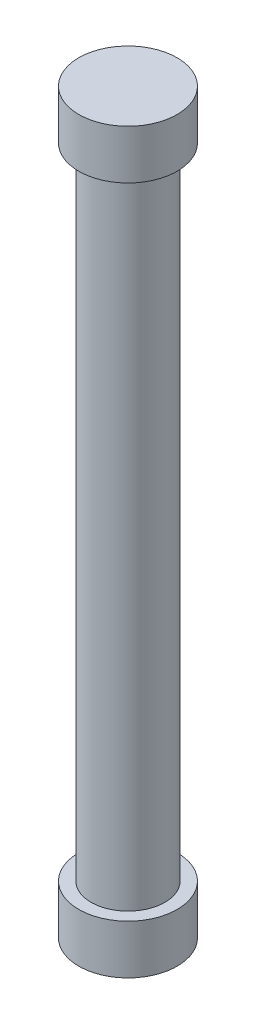
ISO-10303-21;
HEADER;
FILE_DESCRIPTION(('STEP AP214'),'2;1');
FILE_NAME('part.step','',(''),(''),'','','');
FILE_SCHEMA(('AUTOMOTIVE_DESIGN { 1 0 10303 214 1 1 1 1 }'));
ENDSEC;
DATA;
#1=APPLICATION_CONTEXT('core data for automotive mechanical design processes');
#2=APPLICATION_PROTOCOL_DEFINITION('international standard','automotive_design',2000,#1);
#3=PRODUCT_CONTEXT('',#1,'mechanical');
#4=PRODUCT('Part','Part','',(#3));
#5=PRODUCT_RELATED_PRODUCT_CATEGORY('part','',(#4));
#6=PRODUCT_DEFINITION_FORMATION('','',#4);
#7=PRODUCT_DEFINITION_CONTEXT('part definition',#1,'design');
#8=PRODUCT_DEFINITION('design','',#6,#7);
#9=PRODUCT_DEFINITION_SHAPE('','',#8);
#10=(LENGTH_UNIT() NAMED_UNIT(*) SI_UNIT(.MILLI.,.METRE.));
#11=(NAMED_UNIT(*) PLANE_ANGLE_UNIT() SI_UNIT($,.RADIAN.));
#12=(NAMED_UNIT(*) SI_UNIT($,.STERADIAN.) SOLID_ANGLE_UNIT());
#13=UNCERTAINTY_MEASURE_WITH_UNIT(LENGTH_MEASURE(1.E-05),#10,'distance_accuracy_value','');
#14=(GEOMETRIC_REPRESENTATION_CONTEXT(3) GLOBAL_UNCERTAINTY_ASSIGNED_CONTEXT((#13)) GLOBAL_UNIT_ASSIGNED_CONTEXT((#10,
#11,#12)) REPRESENTATION_CONTEXT('',''));
#15=CARTESIAN_POINT('',(0.,0.,0.));
#16=DIRECTION('',(0.,0.,1.));
#17=DIRECTION('',(1.,0.,0.));
#18=AXIS2_PLACEMENT_3D('',#15,#16,#17);
#19=CARTESIAN_POINT('',(-2.,19.89,0.));
#20=DIRECTION('',(0.,1.,0.));
#21=DIRECTION('',(-1.,0.,0.));
#22=AXIS2_PLACEMENT_3D('',#19,#20,#21);
#23=PLANE('',#22);
#24=CARTESIAN_POINT('',(0.,19.89,0.));
#25=DIRECTION('',(0.,1.,0.));
#26=DIRECTION('',(-1.,0.,0.));
#27=AXIS2_PLACEMENT_3D('',#24,#25,#26);
#28=CIRCLE('',#27,2.);
#29=CARTESIAN_POINT('',(-2.,19.89,0.));
#30=VERTEX_POINT('',#29);
#31=EDGE_CURVE('E53',#30,#30,#28,.T.);
#32=ORIENTED_EDGE('',*,*,#31,.T.);
#33=EDGE_LOOP('',(#32));
#34=FACE_BOUND('',#33,.T.);
#35=ADVANCED_FACE('F31',(#34),#23,.T.);
#36=CARTESIAN_POINT('',(0.,-10.11,0.));
#37=DIRECTION('',(0.,-1.,0.));
#38=DIRECTION('',(1.,0.,0.));
#39=AXIS2_PLACEMENT_3D('',#36,#37,#38);
#40=PLANE('',#39);
#41=CARTESIAN_POINT('',(0.,-10.11,0.));
#42=DIRECTION('',(0.,1.,0.));
#43=DIRECTION('',(-1.,0.,0.));
#44=AXIS2_PLACEMENT_3D('',#41,#42,#43);
#45=CIRCLE('',#44,2.);
#46=CARTESIAN_POINT('',(-2.,-10.11,0.));
#47=VERTEX_POINT('',#46);
#48=EDGE_CURVE('E10',#47,#47,#45,.T.);
#49=ORIENTED_EDGE('',*,*,#48,.F.);
#50=EDGE_LOOP('',(#49));
#51=FACE_BOUND('',#50,.T.);
#52=ADVANCED_FACE('F70',(#51),#40,.T.);
#53=CARTESIAN_POINT('',(0.,19.89,0.));
#54=DIRECTION('',(0.,1.,0.));
#55=DIRECTION('',(-1.,0.,0.));
#56=AXIS2_PLACEMENT_3D('',#53,#54,#55);
#57=CYLINDRICAL_SURFACE('',#56,2.);
#58=ORIENTED_EDGE('',*,*,#48,.T.);
#59=EDGE_LOOP('',(#58));
#60=FACE_BOUND('',#59,.T.);
#61=CARTESIAN_POINT('',(0.,-8.10999999999998,0.));
#62=DIRECTION('',(0.,1.,0.));
#63=DIRECTION('',(-1.,0.,0.));
#64=AXIS2_PLACEMENT_3D('',#61,#62,#63);
#65=CIRCLE('',#64,2.);
#66=CARTESIAN_POINT('',(-2.,-8.10999999999998,0.));
#67=VERTEX_POINT('',#66);
#68=EDGE_CURVE('E37',#67,#67,#65,.T.);
#69=ORIENTED_EDGE('',*,*,#68,.F.);
#70=EDGE_LOOP('',(#69));
#71=FACE_BOUND('',#70,.T.);
#72=ADVANCED_FACE('F74',(#60,#71),#57,.T.);
#73=CARTESIAN_POINT('',(-2.,-8.10999999999998,0.));
#74=DIRECTION('',(0.,1.,0.));
#75=DIRECTION('',(-1.,0.,0.));
#76=AXIS2_PLACEMENT_3D('',#73,#74,#75);
#77=PLANE('',#76);
#78=ORIENTED_EDGE('',*,*,#68,.T.);
#79=EDGE_LOOP('',(#78));
#80=FACE_BOUND('',#79,.T.);
#81=CARTESIAN_POINT('',(0.,-8.10999999999998,0.));
#82=DIRECTION('',(0.,1.,0.));
#83=DIRECTION('',(-1.,0.,0.));
#84=AXIS2_PLACEMENT_3D('',#81,#82,#83);
#85=CIRCLE('',#84,1.5);
#86=CARTESIAN_POINT('',(-1.5,-8.10999999999998,0.));
#87=VERTEX_POINT('',#86);
#88=EDGE_CURVE('E41',#87,#87,#85,.T.);
#89=ORIENTED_EDGE('',*,*,#88,.F.);
#90=EDGE_LOOP('',(#89));
#91=FACE_BOUND('',#90,.T.);
#92=ADVANCED_FACE('F79',(#80,#91),#77,.T.);
#93=CARTESIAN_POINT('',(0.,19.89,0.));
#94=DIRECTION('',(0.,1.,0.));
#95=DIRECTION('',(-1.,0.,0.));
#96=AXIS2_PLACEMENT_3D('',#93,#94,#95);
#97=CYLINDRICAL_SURFACE('',#96,1.5);
#98=ORIENTED_EDGE('',*,*,#88,.T.);
#99=EDGE_LOOP('',(#98));
#100=FACE_BOUND('',#99,.T.);
#101=CARTESIAN_POINT('',(0.,17.89,0.));
#102=DIRECTION('',(0.,1.,0.));
#103=DIRECTION('',(-1.,0.,0.));
#104=AXIS2_PLACEMENT_3D('',#101,#102,#103);
#105=CIRCLE('',#104,1.5);
#106=CARTESIAN_POINT('',(-1.5,17.89,0.));
#107=VERTEX_POINT('',#106);
#108=EDGE_CURVE('E45',#107,#107,#105,.T.);
#109=ORIENTED_EDGE('',*,*,#108,.F.);
#110=EDGE_LOOP('',(#109));
#111=FACE_BOUND('',#110,.T.);
#112=ADVANCED_FACE('F66',(#100,#111),#97,.T.);
#113=CARTESIAN_POINT('',(-1.5,17.89,0.));
#114=DIRECTION('',(0.,-1.,0.));
#115=DIRECTION('',(1.,0.,0.));
#116=AXIS2_PLACEMENT_3D('',#113,#114,#115);
#117=PLANE('',#116);
#118=ORIENTED_EDGE('',*,*,#108,.T.);
#119=EDGE_LOOP('',(#118));
#120=FACE_BOUND('',#119,.T.);
#121=CARTESIAN_POINT('',(0.,17.89,0.));
#122=DIRECTION('',(0.,1.,0.));
#123=DIRECTION('',(-1.,0.,0.));
#124=AXIS2_PLACEMENT_3D('',#121,#122,#123);
#125=CIRCLE('',#124,2.);
#126=CARTESIAN_POINT('',(-2.,17.89,0.));
#127=VERTEX_POINT('',#126);
#128=EDGE_CURVE('E50',#127,#127,#125,.T.);
#129=ORIENTED_EDGE('',*,*,#128,.F.);
#130=EDGE_LOOP('',(#129));
#131=FACE_BOUND('',#130,.T.);
#132=ADVANCED_FACE('F60',(#120,#131),#117,.T.);
#133=CARTESIAN_POINT('',(0.,19.89,0.));
#134=DIRECTION('',(0.,1.,0.));
#135=DIRECTION('',(-1.,0.,0.));
#136=AXIS2_PLACEMENT_3D('',#133,#134,#135);
#137=CYLINDRICAL_SURFACE('',#136,2.);
#138=ORIENTED_EDGE('',*,*,#128,.T.);
#139=EDGE_LOOP('',(#138));
#140=FACE_BOUND('',#139,.T.);
#141=ORIENTED_EDGE('',*,*,#31,.F.);
#142=EDGE_LOOP('',(#141));
#143=FACE_BOUND('',#142,.T.);
#144=ADVANCED_FACE('F58',(#140,#143),#137,.T.);
#145=CLOSED_SHELL('',(#35,#52,#72,#92,#112,#132,#144));
#146=MANIFOLD_SOLID_BREP('B2',#145);
#147=ADVANCED_BREP_SHAPE_REPRESENTATION('',(#18,#146),#14);
#148=SHAPE_DEFINITION_REPRESENTATION(#9,#147);
ENDSEC;
END-ISO-10303-21;
